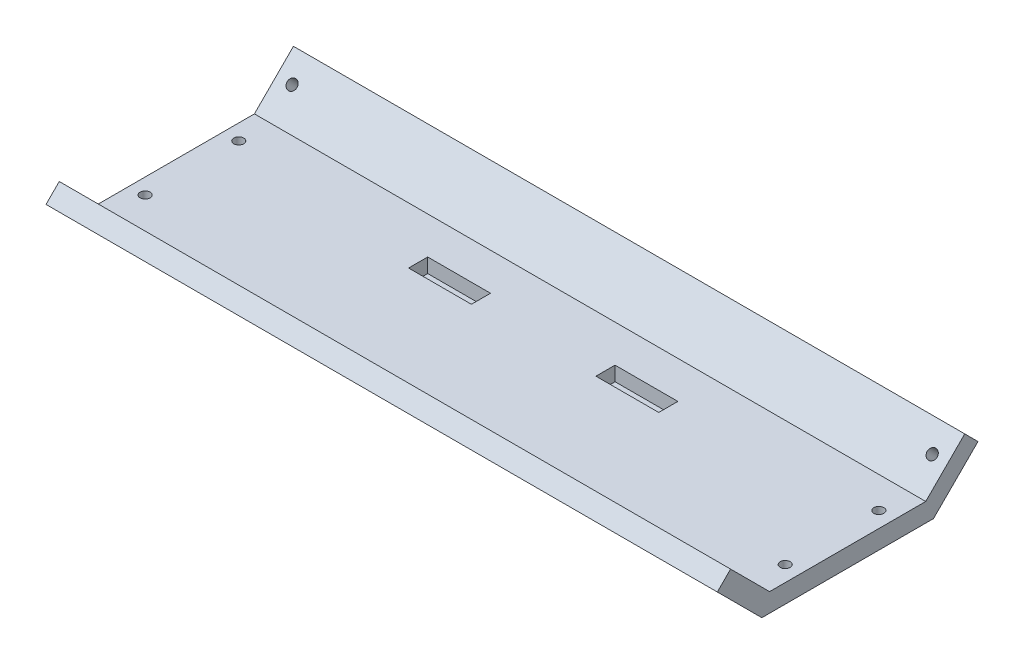
ISO-10303-21;
HEADER;
FILE_DESCRIPTION(('STEP AP214'),'2;1');
FILE_NAME('part.step','',(''),(''),'','','');
FILE_SCHEMA(('AUTOMOTIVE_DESIGN { 1 0 10303 214 1 1 1 1 }'));
ENDSEC;
DATA;
#1=APPLICATION_CONTEXT('core data for automotive mechanical design processes');
#2=APPLICATION_PROTOCOL_DEFINITION('international standard','automotive_design',2000,#1);
#3=PRODUCT_CONTEXT('',#1,'mechanical');
#4=PRODUCT('Part','Part','',(#3));
#5=PRODUCT_RELATED_PRODUCT_CATEGORY('part','',(#4));
#6=PRODUCT_DEFINITION_FORMATION('','',#4);
#7=PRODUCT_DEFINITION_CONTEXT('part definition',#1,'design');
#8=PRODUCT_DEFINITION('design','',#6,#7);
#9=PRODUCT_DEFINITION_SHAPE('','',#8);
#10=(LENGTH_UNIT() NAMED_UNIT(*) SI_UNIT(.MILLI.,.METRE.));
#11=(NAMED_UNIT(*) PLANE_ANGLE_UNIT() SI_UNIT($,.RADIAN.));
#12=(NAMED_UNIT(*) SI_UNIT($,.STERADIAN.) SOLID_ANGLE_UNIT());
#13=UNCERTAINTY_MEASURE_WITH_UNIT(LENGTH_MEASURE(1.E-05),#10,'distance_accuracy_value','');
#14=(GEOMETRIC_REPRESENTATION_CONTEXT(3) GLOBAL_UNCERTAINTY_ASSIGNED_CONTEXT((#13)) GLOBAL_UNIT_ASSIGNED_CONTEXT((#10,
#11,#12)) REPRESENTATION_CONTEXT('',''));
#15=CARTESIAN_POINT('',(0.,0.,0.));
#16=DIRECTION('',(0.,0.,1.));
#17=DIRECTION('',(1.,0.,0.));
#18=AXIS2_PLACEMENT_3D('',#15,#16,#17);
#19=CARTESIAN_POINT('',(-19.9375,-6.,-13.0625));
#20=DIRECTION('',(1.,0.,0.));
#21=DIRECTION('',(0.,0.,-1.));
#22=AXIS2_PLACEMENT_3D('',#19,#20,#21);
#23=PLANE('',#22);
#24=DIRECTION('',(0.,0.,1.));
#25=VECTOR('',#24,1.);
#26=CARTESIAN_POINT('',(-19.9375,-4.6,-13.0625));
#27=LINE('',#26,#25);
#28=CARTESIAN_POINT('',(-19.9375,-4.6,-13.0625));
#29=VERTEX_POINT('',#28);
#30=CARTESIAN_POINT('',(-19.9375,-4.6,-6.9375));
#31=VERTEX_POINT('',#30);
#32=EDGE_CURVE('E54',#29,#31,#27,.T.);
#33=ORIENTED_EDGE('',*,*,#32,.T.);
#34=DIRECTION('',(0.,1.,0.));
#35=VECTOR('',#34,1.);
#36=CARTESIAN_POINT('',(-19.9375,-6.,-6.9375));
#37=LINE('',#36,#35);
#38=CARTESIAN_POINT('',(-19.9375,0.,-6.9375));
#39=VERTEX_POINT('',#38);
#40=EDGE_CURVE('E184',#31,#39,#37,.T.);
#41=ORIENTED_EDGE('',*,*,#40,.T.);
#42=DIRECTION('',(0.,0.,-1.));
#43=VECTOR('',#42,1.);
#44=CARTESIAN_POINT('',(-19.9375,0.,-13.0625));
#45=LINE('',#44,#43);
#46=CARTESIAN_POINT('',(-19.9375,0.,-13.0625));
#47=VERTEX_POINT('',#46);
#48=EDGE_CURVE('E189',#39,#47,#45,.T.);
#49=ORIENTED_EDGE('',*,*,#48,.T.);
#50=DIRECTION('',(0.,1.,0.));
#51=VECTOR('',#50,1.);
#52=CARTESIAN_POINT('',(-19.9375,-6.,-13.0625));
#53=LINE('',#52,#51);
#54=EDGE_CURVE('E162',#29,#47,#53,.T.);
#55=ORIENTED_EDGE('',*,*,#54,.F.);
#56=EDGE_LOOP('',(#33,#41,#49,#55));
#57=FACE_BOUND('',#56,.T.);
#58=ADVANCED_FACE('F39',(#57),#23,.F.);
#59=CARTESIAN_POINT('',(-40.0625,-6.,-6.9375));
#60=DIRECTION('',(0.,0.,1.));
#61=DIRECTION('',(0.,-1.,0.));
#62=AXIS2_PLACEMENT_3D('',#59,#60,#61);
#63=PLANE('',#62);
#64=DIRECTION('',(-1.,0.,0.));
#65=VECTOR('',#64,1.);
#66=CARTESIAN_POINT('',(-19.9375,-4.6,-6.9375));
#67=LINE('',#66,#65);
#68=CARTESIAN_POINT('',(-40.0625,-4.6,-6.9375));
#69=VERTEX_POINT('',#68);
#70=EDGE_CURVE('E61',#31,#69,#67,.T.);
#71=ORIENTED_EDGE('',*,*,#70,.T.);
#72=DIRECTION('',(0.,1.,0.));
#73=VECTOR('',#72,1.);
#74=CARTESIAN_POINT('',(-40.0625,-6.,-6.9375));
#75=LINE('',#74,#73);
#76=CARTESIAN_POINT('',(-40.0625,0.,-6.9375));
#77=VERTEX_POINT('',#76);
#78=EDGE_CURVE('E163',#69,#77,#75,.T.);
#79=ORIENTED_EDGE('',*,*,#78,.T.);
#80=DIRECTION('',(1.,0.,0.));
#81=VECTOR('',#80,1.);
#82=CARTESIAN_POINT('',(-40.0625,0.,-6.9375));
#83=LINE('',#82,#81);
#84=EDGE_CURVE('E207',#77,#39,#83,.T.);
#85=ORIENTED_EDGE('',*,*,#84,.T.);
#86=ORIENTED_EDGE('',*,*,#40,.F.);
#87=EDGE_LOOP('',(#71,#79,#85,#86));
#88=FACE_BOUND('',#87,.T.);
#89=ADVANCED_FACE('F373',(#88),#63,.F.);
#90=CARTESIAN_POINT('',(-40.0625,-6.,-13.0625));
#91=DIRECTION('',(-1.,0.,0.));
#92=DIRECTION('',(0.,0.,1.));
#93=AXIS2_PLACEMENT_3D('',#90,#91,#92);
#94=PLANE('',#93);
#95=DIRECTION('',(0.,0.,-1.));
#96=VECTOR('',#95,1.);
#97=CARTESIAN_POINT('',(-40.0625,-4.6,-13.0625));
#98=LINE('',#97,#96);
#99=CARTESIAN_POINT('',(-40.0625,-4.6,-13.0625));
#100=VERTEX_POINT('',#99);
#101=EDGE_CURVE('E166',#69,#100,#98,.T.);
#102=ORIENTED_EDGE('',*,*,#101,.T.);
#103=DIRECTION('',(0.,1.,0.));
#104=VECTOR('',#103,1.);
#105=CARTESIAN_POINT('',(-40.0625,-6.,-13.0625));
#106=LINE('',#105,#104);
#107=CARTESIAN_POINT('',(-40.0625,0.,-13.0625));
#108=VERTEX_POINT('',#107);
#109=EDGE_CURVE('E152',#100,#108,#106,.T.);
#110=ORIENTED_EDGE('',*,*,#109,.T.);
#111=DIRECTION('',(0.,0.,1.));
#112=VECTOR('',#111,1.);
#113=CARTESIAN_POINT('',(-40.0625,0.,-13.0625));
#114=LINE('',#113,#112);
#115=EDGE_CURVE('E213',#108,#77,#114,.T.);
#116=ORIENTED_EDGE('',*,*,#115,.T.);
#117=ORIENTED_EDGE('',*,*,#78,.F.);
#118=EDGE_LOOP('',(#102,#110,#116,#117));
#119=FACE_BOUND('',#118,.T.);
#120=ADVANCED_FACE('F167',(#119),#94,.F.);
#121=CARTESIAN_POINT('',(-40.0625,-6.,-13.0625));
#122=DIRECTION('',(0.,0.,-1.));
#123=DIRECTION('',(-1.,0.,0.));
#124=AXIS2_PLACEMENT_3D('',#121,#122,#123);
#125=PLANE('',#124);
#126=DIRECTION('',(1.,0.,0.));
#127=VECTOR('',#126,1.);
#128=CARTESIAN_POINT('',(-19.9375,-4.6,-13.0625));
#129=LINE('',#128,#127);
#130=EDGE_CURVE('E156',#100,#29,#129,.T.);
#131=ORIENTED_EDGE('',*,*,#130,.T.);
#132=ORIENTED_EDGE('',*,*,#54,.T.);
#133=DIRECTION('',(-1.,0.,0.));
#134=VECTOR('',#133,1.);
#135=CARTESIAN_POINT('',(-40.0625,0.,-13.0625));
#136=LINE('',#135,#134);
#137=EDGE_CURVE('E158',#47,#108,#136,.T.);
#138=ORIENTED_EDGE('',*,*,#137,.T.);
#139=ORIENTED_EDGE('',*,*,#109,.F.);
#140=EDGE_LOOP('',(#131,#132,#138,#139));
#141=FACE_BOUND('',#140,.T.);
#142=ADVANCED_FACE('F154',(#141),#125,.F.);
#143=CARTESIAN_POINT('',(40.0625,-6.,-13.0625));
#144=DIRECTION('',(1.,0.,0.));
#145=DIRECTION('',(0.,0.,-1.));
#146=AXIS2_PLACEMENT_3D('',#143,#144,#145);
#147=PLANE('',#146);
#148=DIRECTION('',(0.,0.,1.));
#149=VECTOR('',#148,1.);
#150=CARTESIAN_POINT('',(40.0625,-4.6,-13.0625));
#151=LINE('',#150,#149);
#152=CARTESIAN_POINT('',(40.0625,-4.6,-13.0625));
#153=VERTEX_POINT('',#152);
#154=CARTESIAN_POINT('',(40.0625,-4.6,-6.9375));
#155=VERTEX_POINT('',#154);
#156=EDGE_CURVE('E175',#153,#155,#151,.T.);
#157=ORIENTED_EDGE('',*,*,#156,.T.);
#158=DIRECTION('',(0.,1.,0.));
#159=VECTOR('',#158,1.);
#160=CARTESIAN_POINT('',(40.0625,-6.,-6.9375));
#161=LINE('',#160,#159);
#162=CARTESIAN_POINT('',(40.0625,0.,-6.9375));
#163=VERTEX_POINT('',#162);
#164=EDGE_CURVE('E199',#155,#163,#161,.T.);
#165=ORIENTED_EDGE('',*,*,#164,.T.);
#166=DIRECTION('',(0.,0.,-1.));
#167=VECTOR('',#166,1.);
#168=CARTESIAN_POINT('',(40.0625,0.,-13.0625));
#169=LINE('',#168,#167);
#170=CARTESIAN_POINT('',(40.0625,0.,-13.0625));
#171=VERTEX_POINT('',#170);
#172=EDGE_CURVE('E185',#163,#171,#169,.T.);
#173=ORIENTED_EDGE('',*,*,#172,.T.);
#174=DIRECTION('',(0.,1.,0.));
#175=VECTOR('',#174,1.);
#176=CARTESIAN_POINT('',(40.0625,-6.,-13.0625));
#177=LINE('',#176,#175);
#178=EDGE_CURVE('E198',#153,#171,#177,.T.);
#179=ORIENTED_EDGE('',*,*,#178,.F.);
#180=EDGE_LOOP('',(#157,#165,#173,#179));
#181=FACE_BOUND('',#180,.T.);
#182=ADVANCED_FACE('F381',(#181),#147,.F.);
#183=CARTESIAN_POINT('',(19.9375,-6.,-6.9375));
#184=DIRECTION('',(0.,0.,1.));
#185=DIRECTION('',(0.,-1.,0.));
#186=AXIS2_PLACEMENT_3D('',#183,#184,#185);
#187=PLANE('',#186);
#188=DIRECTION('',(-1.,0.,0.));
#189=VECTOR('',#188,1.);
#190=CARTESIAN_POINT('',(40.0625,-4.6,-6.9375));
#191=LINE('',#190,#189);
#192=CARTESIAN_POINT('',(19.9375,-4.6,-6.9375));
#193=VERTEX_POINT('',#192);
#194=EDGE_CURVE('E177',#155,#193,#191,.T.);
#195=ORIENTED_EDGE('',*,*,#194,.T.);
#196=DIRECTION('',(0.,1.,0.));
#197=VECTOR('',#196,1.);
#198=CARTESIAN_POINT('',(19.9375,-6.,-6.9375));
#199=LINE('',#198,#197);
#200=CARTESIAN_POINT('',(19.9375,0.,-6.9375));
#201=VERTEX_POINT('',#200);
#202=EDGE_CURVE('E202',#193,#201,#199,.T.);
#203=ORIENTED_EDGE('',*,*,#202,.T.);
#204=DIRECTION('',(1.,0.,0.));
#205=VECTOR('',#204,1.);
#206=CARTESIAN_POINT('',(19.9375,0.,-6.9375));
#207=LINE('',#206,#205);
#208=EDGE_CURVE('E195',#201,#163,#207,.T.);
#209=ORIENTED_EDGE('',*,*,#208,.T.);
#210=ORIENTED_EDGE('',*,*,#164,.F.);
#211=EDGE_LOOP('',(#195,#203,#209,#210));
#212=FACE_BOUND('',#211,.T.);
#213=ADVANCED_FACE('F554',(#212),#187,.F.);
#214=CARTESIAN_POINT('',(19.9375,-6.,-13.0625));
#215=DIRECTION('',(-1.,0.,0.));
#216=DIRECTION('',(0.,0.,1.));
#217=AXIS2_PLACEMENT_3D('',#214,#215,#216);
#218=PLANE('',#217);
#219=DIRECTION('',(0.,0.,-1.));
#220=VECTOR('',#219,1.);
#221=CARTESIAN_POINT('',(19.9375,-4.6,-13.0625));
#222=LINE('',#221,#220);
#223=CARTESIAN_POINT('',(19.9375,-4.6,-13.0625));
#224=VERTEX_POINT('',#223);
#225=EDGE_CURVE('E179',#193,#224,#222,.T.);
#226=ORIENTED_EDGE('',*,*,#225,.T.);
#227=DIRECTION('',(0.,1.,0.));
#228=VECTOR('',#227,1.);
#229=CARTESIAN_POINT('',(19.9375,-6.,-13.0625));
#230=LINE('',#229,#228);
#231=CARTESIAN_POINT('',(19.9375,0.,-13.0625));
#232=VERTEX_POINT('',#231);
#233=EDGE_CURVE('E204',#224,#232,#230,.T.);
#234=ORIENTED_EDGE('',*,*,#233,.T.);
#235=DIRECTION('',(0.,0.,1.));
#236=VECTOR('',#235,1.);
#237=CARTESIAN_POINT('',(19.9375,0.,-13.0625));
#238=LINE('',#237,#236);
#239=EDGE_CURVE('E192',#232,#201,#238,.T.);
#240=ORIENTED_EDGE('',*,*,#239,.T.);
#241=ORIENTED_EDGE('',*,*,#202,.F.);
#242=EDGE_LOOP('',(#226,#234,#240,#241));
#243=FACE_BOUND('',#242,.T.);
#244=ADVANCED_FACE('F546',(#243),#218,.F.);
#245=CARTESIAN_POINT('',(19.9375,-6.,-13.0625));
#246=DIRECTION('',(0.,0.,-1.));
#247=DIRECTION('',(0.,1.,0.));
#248=AXIS2_PLACEMENT_3D('',#245,#246,#247);
#249=PLANE('',#248);
#250=DIRECTION('',(1.,0.,0.));
#251=VECTOR('',#250,1.);
#252=CARTESIAN_POINT('',(40.0625,-4.6,-13.0625));
#253=LINE('',#252,#251);
#254=EDGE_CURVE('E182',#224,#153,#253,.T.);
#255=ORIENTED_EDGE('',*,*,#254,.T.);
#256=ORIENTED_EDGE('',*,*,#178,.T.);
#257=DIRECTION('',(-1.,0.,0.));
#258=VECTOR('',#257,1.);
#259=CARTESIAN_POINT('',(19.9375,0.,-13.0625));
#260=LINE('',#259,#258);
#261=EDGE_CURVE('E188',#171,#232,#260,.T.);
#262=ORIENTED_EDGE('',*,*,#261,.T.);
#263=ORIENTED_EDGE('',*,*,#233,.F.);
#264=EDGE_LOOP('',(#255,#256,#262,#263));
#265=FACE_BOUND('',#264,.T.);
#266=ADVANCED_FACE('F441',(#265),#249,.F.);
#267=CARTESIAN_POINT('',(107.5,12.4999999999999,37.5000000000001));
#268=DIRECTION('',(0.,-0.707106781186547,-0.707106781186548));
#269=DIRECTION('',(0.,0.707106781186548,-0.707106781186547));
#270=AXIS2_PLACEMENT_3D('',#267,#268,#269);
#271=PLANE('',#270);
#272=DIRECTION('',(0.,-0.707106781186548,0.707106781186547));
#273=VECTOR('',#272,1.);
#274=CARTESIAN_POINT('',(-107.5,12.4999999999999,37.5000000000001));
#275=LINE('',#274,#273);
#276=CARTESIAN_POINT('',(-107.5,12.4999999999999,37.5000000000001));
#277=VERTEX_POINT('',#276);
#278=CARTESIAN_POINT('',(-107.5,8.25735931288065,41.7426406871193));
#279=VERTEX_POINT('',#278);
#280=EDGE_CURVE('E265',#277,#279,#275,.T.);
#281=ORIENTED_EDGE('',*,*,#280,.T.);
#282=DIRECTION('',(-1.,0.,0.));
#283=VECTOR('',#282,1.);
#284=CARTESIAN_POINT('',(107.5,8.25735931288065,41.7426406871193));
#285=LINE('',#284,#283);
#286=CARTESIAN_POINT('',(107.5,8.25735931288065,41.7426406871193));
#287=VERTEX_POINT('',#286);
#288=EDGE_CURVE('E11',#287,#279,#285,.T.);
#289=ORIENTED_EDGE('',*,*,#288,.F.);
#290=DIRECTION('',(0.,-0.707106781186548,0.707106781186547));
#291=VECTOR('',#290,1.);
#292=CARTESIAN_POINT('',(107.5,12.4999999999999,37.5000000000001));
#293=LINE('',#292,#291);
#294=CARTESIAN_POINT('',(107.5,12.4999999999999,37.5000000000001));
#295=VERTEX_POINT('',#294);
#296=EDGE_CURVE('E266',#295,#287,#293,.T.);
#297=ORIENTED_EDGE('',*,*,#296,.F.);
#298=DIRECTION('',(-1.,0.,0.));
#299=VECTOR('',#298,1.);
#300=CARTESIAN_POINT('',(107.5,12.4999999999999,37.5000000000001));
#301=LINE('',#300,#299);
#302=EDGE_CURVE('E284',#295,#277,#301,.T.);
#303=ORIENTED_EDGE('',*,*,#302,.T.);
#304=EDGE_LOOP('',(#281,#289,#297,#303));
#305=FACE_BOUND('',#304,.T.);
#306=ADVANCED_FACE('F41',(#305),#271,.F.);
#307=CARTESIAN_POINT('',(107.5,-6.,27.4852813742388));
#308=DIRECTION('',(0.,0.707106781186545,-0.707106781186551));
#309=DIRECTION('',(0.,0.707106781186551,0.707106781186545));
#310=AXIS2_PLACEMENT_3D('',#307,#308,#309);
#311=PLANE('',#310);
#312=CARTESIAN_POINT('',(-102.5,2.8284271247461,36.3137084989848));
#313=DIRECTION('',(0.,0.707106781186545,-0.707106781186551));
#314=DIRECTION('',(0.,0.707106781186551,0.707106781186545));
#315=AXIS2_PLACEMENT_3D('',#312,#313,#314);
#316=CIRCLE('',#315,1.6);
#317=CARTESIAN_POINT('',(-102.5,3.95979797464458,37.4450793488833));
#318=VERTEX_POINT('',#317);
#319=EDGE_CURVE('E238',#318,#318,#316,.T.);
#320=ORIENTED_EDGE('',*,*,#319,.T.);
#321=EDGE_LOOP('',(#320));
#322=FACE_BOUND('',#321,.T.);
#323=CARTESIAN_POINT('',(102.5,2.8284271247461,36.3137084989848));
#324=DIRECTION('',(0.,0.707106781186545,-0.707106781186551));
#325=DIRECTION('',(0.,0.707106781186551,0.707106781186545));
#326=AXIS2_PLACEMENT_3D('',#323,#324,#325);
#327=CIRCLE('',#326,1.6);
#328=CARTESIAN_POINT('',(102.5,3.95979797464458,37.4450793488833));
#329=VERTEX_POINT('',#328);
#330=EDGE_CURVE('E244',#329,#329,#327,.T.);
#331=ORIENTED_EDGE('',*,*,#330,.T.);
#332=EDGE_LOOP('',(#331));
#333=FACE_BOUND('',#332,.T.);
#334=DIRECTION('',(0.,-0.707106781186551,-0.707106781186544));
#335=VECTOR('',#334,1.);
#336=CARTESIAN_POINT('',(-107.5,-6.,27.4852813742388));
#337=LINE('',#336,#335);
#338=CARTESIAN_POINT('',(-107.5,-6.,27.4852813742388));
#339=VERTEX_POINT('',#338);
#340=EDGE_CURVE('E287',#279,#339,#337,.T.);
#341=ORIENTED_EDGE('',*,*,#340,.T.);
#342=DIRECTION('',(-1.,0.,0.));
#343=VECTOR('',#342,1.);
#344=CARTESIAN_POINT('',(107.5,-6.,27.4852813742388));
#345=LINE('',#344,#343);
#346=CARTESIAN_POINT('',(107.5,-6.,27.4852813742388));
#347=VERTEX_POINT('',#346);
#348=EDGE_CURVE('E47',#347,#339,#345,.T.);
#349=ORIENTED_EDGE('',*,*,#348,.F.);
#350=DIRECTION('',(0.,-0.707106781186551,-0.707106781186544));
#351=VECTOR('',#350,1.);
#352=CARTESIAN_POINT('',(107.5,-6.,27.4852813742388));
#353=LINE('',#352,#351);
#354=EDGE_CURVE('E269',#287,#347,#353,.T.);
#355=ORIENTED_EDGE('',*,*,#354,.F.);
#356=ORIENTED_EDGE('',*,*,#288,.T.);
#357=EDGE_LOOP('',(#341,#349,#355,#356));
#358=FACE_BOUND('',#357,.T.);
#359=ADVANCED_FACE('F344',(#322,#333,#358),#311,.F.);
#360=CARTESIAN_POINT('',(107.5,-6.,27.4852813742388));
#361=DIRECTION('',(0.,1.,0.));
#362=DIRECTION('',(0.,0.,1.));
#363=AXIS2_PLACEMENT_3D('',#360,#361,#362);
#364=PLANE('',#363);
#365=CARTESIAN_POINT('',(-102.5,-6.,-15.0000000000001));
#366=DIRECTION('',(0.,1.,0.));
#367=DIRECTION('',(0.,0.,1.));
#368=AXIS2_PLACEMENT_3D('',#365,#366,#367);
#369=CIRCLE('',#368,1.6);
#370=CARTESIAN_POINT('',(-102.5,-6.,-13.4000000000001));
#371=VERTEX_POINT('',#370);
#372=EDGE_CURVE('E226',#371,#371,#369,.T.);
#373=ORIENTED_EDGE('',*,*,#372,.T.);
#374=EDGE_LOOP('',(#373));
#375=FACE_BOUND('',#374,.T.);
#376=CARTESIAN_POINT('',(-102.5,-6.,15.0000000000001));
#377=DIRECTION('',(0.,1.,0.));
#378=DIRECTION('',(0.,0.,1.));
#379=AXIS2_PLACEMENT_3D('',#376,#377,#378);
#380=CIRCLE('',#379,1.6);
#381=CARTESIAN_POINT('',(-102.5,-6.,16.6000000000001));
#382=VERTEX_POINT('',#381);
#383=EDGE_CURVE('E232',#382,#382,#380,.T.);
#384=ORIENTED_EDGE('',*,*,#383,.T.);
#385=EDGE_LOOP('',(#384));
#386=FACE_BOUND('',#385,.T.);
#387=CARTESIAN_POINT('',(102.5,-6.,15.0000000000001));
#388=DIRECTION('',(0.,1.,0.));
#389=DIRECTION('',(0.,0.,1.));
#390=AXIS2_PLACEMENT_3D('',#387,#388,#389);
#391=CIRCLE('',#390,1.6);
#392=CARTESIAN_POINT('',(102.5,-6.,16.6000000000001));
#393=VERTEX_POINT('',#392);
#394=EDGE_CURVE('E250',#393,#393,#391,.T.);
#395=ORIENTED_EDGE('',*,*,#394,.T.);
#396=EDGE_LOOP('',(#395));
#397=FACE_BOUND('',#396,.T.);
#398=CARTESIAN_POINT('',(102.5,-6.,-15.0000000000001));
#399=DIRECTION('',(0.,1.,0.));
#400=DIRECTION('',(0.,0.,1.));
#401=AXIS2_PLACEMENT_3D('',#398,#399,#400);
#402=CIRCLE('',#401,1.6);
#403=CARTESIAN_POINT('',(102.5,-6.,-13.4000000000001));
#404=VERTEX_POINT('',#403);
#405=EDGE_CURVE('E256',#404,#404,#402,.T.);
#406=ORIENTED_EDGE('',*,*,#405,.T.);
#407=EDGE_LOOP('',(#406));
#408=FACE_BOUND('',#407,.T.);
#409=DIRECTION('',(0.,0.,-1.));
#410=VECTOR('',#409,1.);
#411=CARTESIAN_POINT('',(-107.5,-6.,27.4852813742388));
#412=LINE('',#411,#410);
#413=CARTESIAN_POINT('',(-107.5,-6.,-27.4852813742387));
#414=VERTEX_POINT('',#413);
#415=EDGE_CURVE('E289',#339,#414,#412,.T.);
#416=ORIENTED_EDGE('',*,*,#415,.T.);
#417=DIRECTION('',(-1.,0.,0.));
#418=VECTOR('',#417,1.);
#419=CARTESIAN_POINT('',(107.5,-6.,-27.4852813742387));
#420=LINE('',#419,#418);
#421=CARTESIAN_POINT('',(107.5,-6.,-27.4852813742387));
#422=VERTEX_POINT('',#421);
#423=EDGE_CURVE('E314',#422,#414,#420,.T.);
#424=ORIENTED_EDGE('',*,*,#423,.F.);
#425=DIRECTION('',(0.,0.,-1.));
#426=VECTOR('',#425,1.);
#427=CARTESIAN_POINT('',(107.5,-6.,27.4852813742388));
#428=LINE('',#427,#426);
#429=EDGE_CURVE('E272',#347,#422,#428,.T.);
#430=ORIENTED_EDGE('',*,*,#429,.F.);
#431=ORIENTED_EDGE('',*,*,#348,.T.);
#432=EDGE_LOOP('',(#416,#424,#430,#431));
#433=FACE_BOUND('',#432,.T.);
#434=ADVANCED_FACE('F321',(#375,#386,#397,#408,#433),#364,.F.);
#435=CARTESIAN_POINT('',(107.5,-6.,-27.4852813742387));
#436=DIRECTION('',(0.,0.707106781186547,0.707106781186548));
#437=DIRECTION('',(0.,-0.707106781186548,0.707106781186547));
#438=AXIS2_PLACEMENT_3D('',#435,#436,#437);
#439=PLANE('',#438);
#440=CARTESIAN_POINT('',(-102.5,2.82842712474617,-36.3137084989848));
#441=DIRECTION('',(0.,0.707106781186547,0.707106781186548));
#442=DIRECTION('',(0.,-0.707106781186548,0.707106781186547));
#443=AXIS2_PLACEMENT_3D('',#440,#441,#442);
#444=CIRCLE('',#443,1.6);
#445=CARTESIAN_POINT('',(-102.5,1.69705627484769,-35.1823376490863));
#446=VERTEX_POINT('',#445);
#447=EDGE_CURVE('E220',#446,#446,#444,.T.);
#448=ORIENTED_EDGE('',*,*,#447,.T.);
#449=EDGE_LOOP('',(#448));
#450=FACE_BOUND('',#449,.T.);
#451=CARTESIAN_POINT('',(102.5,2.82842712474615,-36.3137084989848));
#452=DIRECTION('',(0.,0.707106781186547,0.707106781186548));
#453=DIRECTION('',(0.,-0.707106781186548,0.707106781186547));
#454=AXIS2_PLACEMENT_3D('',#451,#452,#453);
#455=CIRCLE('',#454,1.6);
#456=CARTESIAN_POINT('',(102.5,1.69705627484767,-35.1823376490863));
#457=VERTEX_POINT('',#456);
#458=EDGE_CURVE('E262',#457,#457,#455,.T.);
#459=ORIENTED_EDGE('',*,*,#458,.T.);
#460=EDGE_LOOP('',(#459));
#461=FACE_BOUND('',#460,.T.);
#462=DIRECTION('',(0.,0.707106781186548,-0.707106781186547));
#463=VECTOR('',#462,1.);
#464=CARTESIAN_POINT('',(-107.5,-6.,-27.4852813742387));
#465=LINE('',#464,#463);
#466=CARTESIAN_POINT('',(-107.5,8.25735931288065,-41.7426406871193));
#467=VERTEX_POINT('',#466);
#468=EDGE_CURVE('E291',#414,#467,#465,.T.);
#469=ORIENTED_EDGE('',*,*,#468,.T.);
#470=DIRECTION('',(-1.,0.,0.));
#471=VECTOR('',#470,1.);
#472=CARTESIAN_POINT('',(107.5,8.25735931288065,-41.7426406871193));
#473=LINE('',#472,#471);
#474=CARTESIAN_POINT('',(107.5,8.25735931288065,-41.7426406871193));
#475=VERTEX_POINT('',#474);
#476=EDGE_CURVE('E311',#475,#467,#473,.T.);
#477=ORIENTED_EDGE('',*,*,#476,.F.);
#478=DIRECTION('',(0.,0.707106781186548,-0.707106781186547));
#479=VECTOR('',#478,1.);
#480=CARTESIAN_POINT('',(107.5,-6.,-27.4852813742387));
#481=LINE('',#480,#479);
#482=EDGE_CURVE('E274',#422,#475,#481,.T.);
#483=ORIENTED_EDGE('',*,*,#482,.F.);
#484=ORIENTED_EDGE('',*,*,#423,.T.);
#485=EDGE_LOOP('',(#469,#477,#483,#484));
#486=FACE_BOUND('',#485,.T.);
#487=ADVANCED_FACE('F332',(#450,#461,#486),#439,.F.);
#488=CARTESIAN_POINT('',(107.5,12.5,-37.5));
#489=DIRECTION('',(0.,-0.707106781186547,0.707106781186548));
#490=DIRECTION('',(0.,-0.707106781186548,-0.707106781186547));
#491=AXIS2_PLACEMENT_3D('',#488,#489,#490);
#492=PLANE('',#491);
#493=DIRECTION('',(0.,0.707106781186548,0.707106781186547));
#494=VECTOR('',#493,1.);
#495=CARTESIAN_POINT('',(-107.5,12.5,-37.5));
#496=LINE('',#495,#494);
#497=CARTESIAN_POINT('',(-107.5,12.5,-37.5));
#498=VERTEX_POINT('',#497);
#499=EDGE_CURVE('E293',#467,#498,#496,.T.);
#500=ORIENTED_EDGE('',*,*,#499,.T.);
#501=DIRECTION('',(-1.,0.,0.));
#502=VECTOR('',#501,1.);
#503=CARTESIAN_POINT('',(107.5,12.5,-37.5));
#504=LINE('',#503,#502);
#505=CARTESIAN_POINT('',(107.5,12.5,-37.5));
#506=VERTEX_POINT('',#505);
#507=EDGE_CURVE('E308',#506,#498,#504,.T.);
#508=ORIENTED_EDGE('',*,*,#507,.F.);
#509=DIRECTION('',(0.,0.707106781186548,0.707106781186547));
#510=VECTOR('',#509,1.);
#511=CARTESIAN_POINT('',(107.5,12.5,-37.5));
#512=LINE('',#511,#510);
#513=EDGE_CURVE('E276',#475,#506,#512,.T.);
#514=ORIENTED_EDGE('',*,*,#513,.F.);
#515=ORIENTED_EDGE('',*,*,#476,.T.);
#516=EDGE_LOOP('',(#500,#508,#514,#515));
#517=FACE_BOUND('',#516,.T.);
#518=ADVANCED_FACE('F336',(#517),#492,.F.);
#519=CARTESIAN_POINT('',(107.5,0.,-25.0000000000001));
#520=DIRECTION('',(0.,-0.707106781186546,-0.707106781186549));
#521=DIRECTION('',(0.,0.707106781186549,-0.707106781186546));
#522=AXIS2_PLACEMENT_3D('',#519,#520,#521);
#523=PLANE('',#522);
#524=CARTESIAN_POINT('',(-102.5,7.07106781186545,-32.0710678118655));
#525=DIRECTION('',(0.,0.707106781186546,0.707106781186549));
#526=DIRECTION('',(0.,-0.707106781186549,0.707106781186546));
#527=AXIS2_PLACEMENT_3D('',#524,#525,#526);
#528=CIRCLE('',#527,1.6);
#529=CARTESIAN_POINT('',(-102.5,5.93969696196697,-30.9396969619671));
#530=VERTEX_POINT('',#529);
#531=EDGE_CURVE('E201',#530,#530,#528,.T.);
#532=ORIENTED_EDGE('',*,*,#531,.F.);
#533=EDGE_LOOP('',(#532));
#534=FACE_BOUND('',#533,.T.);
#535=CARTESIAN_POINT('',(102.5,7.07106781186544,-32.0710678118655));
#536=DIRECTION('',(0.,0.707106781186546,0.707106781186549));
#537=DIRECTION('',(0.,-0.707106781186549,0.707106781186546));
#538=AXIS2_PLACEMENT_3D('',#535,#536,#537);
#539=CIRCLE('',#538,1.6);
#540=CARTESIAN_POINT('',(102.5,5.93969696196696,-30.939696961967));
#541=VERTEX_POINT('',#540);
#542=EDGE_CURVE('E259',#541,#541,#539,.T.);
#543=ORIENTED_EDGE('',*,*,#542,.F.);
#544=EDGE_LOOP('',(#543));
#545=FACE_BOUND('',#544,.T.);
#546=DIRECTION('',(0.,-0.707106781186549,0.707106781186546));
#547=VECTOR('',#546,1.);
#548=CARTESIAN_POINT('',(-107.5,0.,-25.0000000000001));
#549=LINE('',#548,#547);
#550=CARTESIAN_POINT('',(-107.5,0.,-25.0000000000001));
#551=VERTEX_POINT('',#550);
#552=EDGE_CURVE('E295',#498,#551,#549,.T.);
#553=ORIENTED_EDGE('',*,*,#552,.T.);
#554=DIRECTION('',(-1.,0.,0.));
#555=VECTOR('',#554,1.);
#556=CARTESIAN_POINT('',(107.5,0.,-25.0000000000001));
#557=LINE('',#556,#555);
#558=CARTESIAN_POINT('',(107.5,0.,-25.0000000000001));
#559=VERTEX_POINT('',#558);
#560=EDGE_CURVE('E305',#559,#551,#557,.T.);
#561=ORIENTED_EDGE('',*,*,#560,.F.);
#562=DIRECTION('',(0.,-0.707106781186549,0.707106781186546));
#563=VECTOR('',#562,1.);
#564=CARTESIAN_POINT('',(107.5,0.,-25.0000000000001));
#565=LINE('',#564,#563);
#566=EDGE_CURVE('E278',#506,#559,#565,.T.);
#567=ORIENTED_EDGE('',*,*,#566,.F.);
#568=ORIENTED_EDGE('',*,*,#507,.T.);
#569=EDGE_LOOP('',(#553,#561,#567,#568));
#570=FACE_BOUND('',#569,.T.);
#571=ADVANCED_FACE('F357',(#534,#545,#570),#523,.F.);
#572=CARTESIAN_POINT('',(107.5,0.,25.0000000000001));
#573=DIRECTION('',(0.,-1.,0.));
#574=DIRECTION('',(0.,0.,-1.));
#575=AXIS2_PLACEMENT_3D('',#572,#573,#574);
#576=PLANE('',#575);
#577=ORIENTED_EDGE('',*,*,#261,.F.);
#578=ORIENTED_EDGE('',*,*,#172,.F.);
#579=ORIENTED_EDGE('',*,*,#208,.F.);
#580=ORIENTED_EDGE('',*,*,#239,.F.);
#581=EDGE_LOOP('',(#577,#578,#579,#580));
#582=FACE_BOUND('',#581,.T.);
#583=ORIENTED_EDGE('',*,*,#137,.F.);
#584=ORIENTED_EDGE('',*,*,#48,.F.);
#585=ORIENTED_EDGE('',*,*,#84,.F.);
#586=ORIENTED_EDGE('',*,*,#115,.F.);
#587=EDGE_LOOP('',(#583,#584,#585,#586));
#588=FACE_BOUND('',#587,.T.);
#589=CARTESIAN_POINT('',(-102.5,0.,-15.0000000000001));
#590=DIRECTION('',(0.,1.,0.));
#591=DIRECTION('',(0.,0.,1.));
#592=AXIS2_PLACEMENT_3D('',#589,#590,#591);
#593=CIRCLE('',#592,1.6);
#594=CARTESIAN_POINT('',(-102.5,0.,-13.4000000000001));
#595=VERTEX_POINT('',#594);
#596=EDGE_CURVE('E223',#595,#595,#593,.T.);
#597=ORIENTED_EDGE('',*,*,#596,.F.);
#598=EDGE_LOOP('',(#597));
#599=FACE_BOUND('',#598,.T.);
#600=CARTESIAN_POINT('',(-102.5,0.,15.0000000000001));
#601=DIRECTION('',(0.,1.,0.));
#602=DIRECTION('',(0.,0.,1.));
#603=AXIS2_PLACEMENT_3D('',#600,#601,#602);
#604=CIRCLE('',#603,1.6);
#605=CARTESIAN_POINT('',(-102.5,0.,16.6000000000001));
#606=VERTEX_POINT('',#605);
#607=EDGE_CURVE('E229',#606,#606,#604,.T.);
#608=ORIENTED_EDGE('',*,*,#607,.F.);
#609=EDGE_LOOP('',(#608));
#610=FACE_BOUND('',#609,.T.);
#611=CARTESIAN_POINT('',(102.5,0.,15.0000000000001));
#612=DIRECTION('',(0.,1.,0.));
#613=DIRECTION('',(0.,0.,1.));
#614=AXIS2_PLACEMENT_3D('',#611,#612,#613);
#615=CIRCLE('',#614,1.6);
#616=CARTESIAN_POINT('',(102.5,0.,16.6000000000001));
#617=VERTEX_POINT('',#616);
#618=EDGE_CURVE('E247',#617,#617,#615,.T.);
#619=ORIENTED_EDGE('',*,*,#618,.F.);
#620=EDGE_LOOP('',(#619));
#621=FACE_BOUND('',#620,.T.);
#622=CARTESIAN_POINT('',(102.5,0.,-15.0000000000001));
#623=DIRECTION('',(0.,1.,0.));
#624=DIRECTION('',(0.,0.,1.));
#625=AXIS2_PLACEMENT_3D('',#622,#623,#624);
#626=CIRCLE('',#625,1.6);
#627=CARTESIAN_POINT('',(102.5,0.,-13.4000000000001));
#628=VERTEX_POINT('',#627);
#629=EDGE_CURVE('E253',#628,#628,#626,.T.);
#630=ORIENTED_EDGE('',*,*,#629,.F.);
#631=EDGE_LOOP('',(#630));
#632=FACE_BOUND('',#631,.T.);
#633=DIRECTION('',(0.,0.,1.));
#634=VECTOR('',#633,1.);
#635=CARTESIAN_POINT('',(-107.5,0.,25.0000000000001));
#636=LINE('',#635,#634);
#637=CARTESIAN_POINT('',(-107.5,0.,25.0000000000001));
#638=VERTEX_POINT('',#637);
#639=EDGE_CURVE('E297',#551,#638,#636,.T.);
#640=ORIENTED_EDGE('',*,*,#639,.T.);
#641=DIRECTION('',(-1.,0.,0.));
#642=VECTOR('',#641,1.);
#643=CARTESIAN_POINT('',(107.5,0.,25.0000000000001));
#644=LINE('',#643,#642);
#645=CARTESIAN_POINT('',(107.5,0.,25.0000000000001));
#646=VERTEX_POINT('',#645);
#647=EDGE_CURVE('E302',#646,#638,#644,.T.);
#648=ORIENTED_EDGE('',*,*,#647,.F.);
#649=DIRECTION('',(0.,0.,1.));
#650=VECTOR('',#649,1.);
#651=CARTESIAN_POINT('',(107.5,0.,25.0000000000001));
#652=LINE('',#651,#650);
#653=EDGE_CURVE('E280',#559,#646,#652,.T.);
#654=ORIENTED_EDGE('',*,*,#653,.F.);
#655=ORIENTED_EDGE('',*,*,#560,.T.);
#656=EDGE_LOOP('',(#640,#648,#654,#655));
#657=FACE_BOUND('',#656,.T.);
#658=ADVANCED_FACE('F355',(#582,#588,#599,#610,#621,#632,#657),#576,.F.);
#659=CARTESIAN_POINT('',(107.5,0.,25.0000000000001));
#660=DIRECTION('',(0.,-0.707106781186551,0.707106781186544));
#661=DIRECTION('',(0.,-0.707106781186544,-0.707106781186551));
#662=AXIS2_PLACEMENT_3D('',#659,#660,#661);
#663=PLANE('',#662);
#664=CARTESIAN_POINT('',(-102.5,7.0710678118654,32.0710678118655));
#665=DIRECTION('',(0.,0.707106781186551,-0.707106781186544));
#666=DIRECTION('',(0.,0.707106781186544,0.707106781186551));
#667=AXIS2_PLACEMENT_3D('',#664,#665,#666);
#668=CIRCLE('',#667,1.6);
#669=CARTESIAN_POINT('',(-102.5,8.20243866176388,33.202438661764));
#670=VERTEX_POINT('',#669);
#671=EDGE_CURVE('E235',#670,#670,#668,.T.);
#672=ORIENTED_EDGE('',*,*,#671,.F.);
#673=EDGE_LOOP('',(#672));
#674=FACE_BOUND('',#673,.T.);
#675=CARTESIAN_POINT('',(102.5,7.0710678118654,32.0710678118655));
#676=DIRECTION('',(0.,0.707106781186551,-0.707106781186544));
#677=DIRECTION('',(0.,0.707106781186544,0.707106781186551));
#678=AXIS2_PLACEMENT_3D('',#675,#676,#677);
#679=CIRCLE('',#678,1.6);
#680=CARTESIAN_POINT('',(102.5,8.20243866176388,33.202438661764));
#681=VERTEX_POINT('',#680);
#682=EDGE_CURVE('E241',#681,#681,#679,.T.);
#683=ORIENTED_EDGE('',*,*,#682,.F.);
#684=EDGE_LOOP('',(#683));
#685=FACE_BOUND('',#684,.T.);
#686=DIRECTION('',(0.,0.707106781186544,0.707106781186551));
#687=VECTOR('',#686,1.);
#688=CARTESIAN_POINT('',(-107.5,0.,25.0000000000001));
#689=LINE('',#688,#687);
#690=EDGE_CURVE('E270',#638,#277,#689,.T.);
#691=ORIENTED_EDGE('',*,*,#690,.T.);
#692=ORIENTED_EDGE('',*,*,#302,.F.);
#693=DIRECTION('',(0.,0.707106781186544,0.707106781186551));
#694=VECTOR('',#693,1.);
#695=CARTESIAN_POINT('',(107.5,0.,25.0000000000001));
#696=LINE('',#695,#694);
#697=EDGE_CURVE('E282',#646,#295,#696,.T.);
#698=ORIENTED_EDGE('',*,*,#697,.F.);
#699=ORIENTED_EDGE('',*,*,#647,.T.);
#700=EDGE_LOOP('',(#691,#692,#698,#699));
#701=FACE_BOUND('',#700,.T.);
#702=ADVANCED_FACE('F350',(#674,#685,#701),#663,.F.);
#703=CARTESIAN_POINT('',(107.5,0.,0.));
#704=DIRECTION('',(-1.,0.,0.));
#705=DIRECTION('',(0.,0.,1.));
#706=AXIS2_PLACEMENT_3D('',#703,#704,#705);
#707=PLANE('',#706);
#708=ORIENTED_EDGE('',*,*,#296,.T.);
#709=ORIENTED_EDGE('',*,*,#354,.T.);
#710=ORIENTED_EDGE('',*,*,#429,.T.);
#711=ORIENTED_EDGE('',*,*,#482,.T.);
#712=ORIENTED_EDGE('',*,*,#513,.T.);
#713=ORIENTED_EDGE('',*,*,#566,.T.);
#714=ORIENTED_EDGE('',*,*,#653,.T.);
#715=ORIENTED_EDGE('',*,*,#697,.T.);
#716=EDGE_LOOP('',(#708,#709,#710,#711,#712,#713,#714,#715));
#717=FACE_BOUND('',#716,.T.);
#718=ADVANCED_FACE('F340',(#717),#707,.F.);
#719=CARTESIAN_POINT('',(-107.5,0.,0.));
#720=DIRECTION('',(-1.,0.,0.));
#721=DIRECTION('',(0.,0.,1.));
#722=AXIS2_PLACEMENT_3D('',#719,#720,#721);
#723=PLANE('',#722);
#724=ORIENTED_EDGE('',*,*,#280,.F.);
#725=ORIENTED_EDGE('',*,*,#690,.F.);
#726=ORIENTED_EDGE('',*,*,#639,.F.);
#727=ORIENTED_EDGE('',*,*,#552,.F.);
#728=ORIENTED_EDGE('',*,*,#499,.F.);
#729=ORIENTED_EDGE('',*,*,#468,.F.);
#730=ORIENTED_EDGE('',*,*,#415,.F.);
#731=ORIENTED_EDGE('',*,*,#340,.F.);
#732=EDGE_LOOP('',(#724,#725,#726,#727,#728,#729,#730,#731));
#733=FACE_BOUND('',#732,.T.);
#734=ADVANCED_FACE('F327',(#733),#723,.T.);
#735=CARTESIAN_POINT('',(102.5,7.07106781186544,-32.0710678118655));
#736=DIRECTION('',(0.,0.707106781186546,0.707106781186549));
#737=DIRECTION('',(0.,-0.707106781186549,0.707106781186546));
#738=AXIS2_PLACEMENT_3D('',#735,#736,#737);
#739=CYLINDRICAL_SURFACE('',#738,1.6);
#740=ORIENTED_EDGE('',*,*,#542,.T.);
#741=EDGE_LOOP('',(#740));
#742=FACE_BOUND('',#741,.T.);
#743=ORIENTED_EDGE('',*,*,#458,.F.);
#744=EDGE_LOOP('',(#743));
#745=FACE_BOUND('',#744,.T.);
#746=ADVANCED_FACE('F415',(#742,#745),#739,.F.);
#747=CARTESIAN_POINT('',(102.5,0.,-15.0000000000001));
#748=DIRECTION('',(0.,1.,0.));
#749=DIRECTION('',(0.,0.,1.));
#750=AXIS2_PLACEMENT_3D('',#747,#748,#749);
#751=CYLINDRICAL_SURFACE('',#750,1.6);
#752=ORIENTED_EDGE('',*,*,#405,.F.);
#753=EDGE_LOOP('',(#752));
#754=FACE_BOUND('',#753,.T.);
#755=ORIENTED_EDGE('',*,*,#629,.T.);
#756=EDGE_LOOP('',(#755));
#757=FACE_BOUND('',#756,.T.);
#758=ADVANCED_FACE('F411',(#754,#757),#751,.F.);
#759=CARTESIAN_POINT('',(102.5,0.,15.0000000000001));
#760=DIRECTION('',(0.,1.,0.));
#761=DIRECTION('',(0.,0.,1.));
#762=AXIS2_PLACEMENT_3D('',#759,#760,#761);
#763=CYLINDRICAL_SURFACE('',#762,1.6);
#764=ORIENTED_EDGE('',*,*,#394,.F.);
#765=EDGE_LOOP('',(#764));
#766=FACE_BOUND('',#765,.T.);
#767=ORIENTED_EDGE('',*,*,#618,.T.);
#768=EDGE_LOOP('',(#767));
#769=FACE_BOUND('',#768,.T.);
#770=ADVANCED_FACE('F407',(#766,#769),#763,.F.);
#771=CARTESIAN_POINT('',(102.5,7.0710678118654,32.0710678118655));
#772=DIRECTION('',(0.,0.707106781186551,-0.707106781186544));
#773=DIRECTION('',(0.,0.707106781186544,0.707106781186551));
#774=AXIS2_PLACEMENT_3D('',#771,#772,#773);
#775=CYLINDRICAL_SURFACE('',#774,1.6);
#776=ORIENTED_EDGE('',*,*,#682,.T.);
#777=EDGE_LOOP('',(#776));
#778=FACE_BOUND('',#777,.T.);
#779=ORIENTED_EDGE('',*,*,#330,.F.);
#780=EDGE_LOOP('',(#779));
#781=FACE_BOUND('',#780,.T.);
#782=ADVANCED_FACE('F403',(#778,#781),#775,.F.);
#783=CARTESIAN_POINT('',(-102.5,7.0710678118654,32.0710678118655));
#784=DIRECTION('',(0.,0.707106781186551,-0.707106781186544));
#785=DIRECTION('',(0.,0.707106781186544,0.707106781186551));
#786=AXIS2_PLACEMENT_3D('',#783,#784,#785);
#787=CYLINDRICAL_SURFACE('',#786,1.6);
#788=ORIENTED_EDGE('',*,*,#671,.T.);
#789=EDGE_LOOP('',(#788));
#790=FACE_BOUND('',#789,.T.);
#791=ORIENTED_EDGE('',*,*,#319,.F.);
#792=EDGE_LOOP('',(#791));
#793=FACE_BOUND('',#792,.T.);
#794=ADVANCED_FACE('F399',(#790,#793),#787,.F.);
#795=CARTESIAN_POINT('',(-102.5,0.,15.0000000000001));
#796=DIRECTION('',(0.,1.,0.));
#797=DIRECTION('',(0.,0.,1.));
#798=AXIS2_PLACEMENT_3D('',#795,#796,#797);
#799=CYLINDRICAL_SURFACE('',#798,1.6);
#800=ORIENTED_EDGE('',*,*,#383,.F.);
#801=EDGE_LOOP('',(#800));
#802=FACE_BOUND('',#801,.T.);
#803=ORIENTED_EDGE('',*,*,#607,.T.);
#804=EDGE_LOOP('',(#803));
#805=FACE_BOUND('',#804,.T.);
#806=ADVANCED_FACE('F395',(#802,#805),#799,.F.);
#807=CARTESIAN_POINT('',(-102.5,0.,-15.0000000000001));
#808=DIRECTION('',(0.,1.,0.));
#809=DIRECTION('',(0.,0.,1.));
#810=AXIS2_PLACEMENT_3D('',#807,#808,#809);
#811=CYLINDRICAL_SURFACE('',#810,1.6);
#812=ORIENTED_EDGE('',*,*,#372,.F.);
#813=EDGE_LOOP('',(#812));
#814=FACE_BOUND('',#813,.T.);
#815=ORIENTED_EDGE('',*,*,#596,.T.);
#816=EDGE_LOOP('',(#815));
#817=FACE_BOUND('',#816,.T.);
#818=ADVANCED_FACE('F391',(#814,#817),#811,.F.);
#819=CARTESIAN_POINT('',(-102.5,7.07106781186545,-32.0710678118655));
#820=DIRECTION('',(0.,0.707106781186546,0.707106781186549));
#821=DIRECTION('',(0.,-0.707106781186549,0.707106781186546));
#822=AXIS2_PLACEMENT_3D('',#819,#820,#821);
#823=CYLINDRICAL_SURFACE('',#822,1.6);
#824=ORIENTED_EDGE('',*,*,#531,.T.);
#825=EDGE_LOOP('',(#824));
#826=FACE_BOUND('',#825,.T.);
#827=ORIENTED_EDGE('',*,*,#447,.F.);
#828=EDGE_LOOP('',(#827));
#829=FACE_BOUND('',#828,.T.);
#830=ADVANCED_FACE('F387',(#826,#829),#823,.F.);
#831=CARTESIAN_POINT('',(0.,-4.6,0.));
#832=DIRECTION('',(0.,-1.,0.));
#833=DIRECTION('',(0.,0.,-1.));
#834=AXIS2_PLACEMENT_3D('',#831,#832,#833);
#835=PLANE('',#834);
#836=ORIENTED_EDGE('',*,*,#156,.F.);
#837=ORIENTED_EDGE('',*,*,#254,.F.);
#838=ORIENTED_EDGE('',*,*,#225,.F.);
#839=ORIENTED_EDGE('',*,*,#194,.F.);
#840=EDGE_LOOP('',(#836,#837,#838,#839));
#841=FACE_BOUND('',#840,.T.);
#842=ADVANCED_FACE('F390',(#841),#835,.F.);
#843=CARTESIAN_POINT('',(0.,-4.6,0.));
#844=DIRECTION('',(0.,-1.,0.));
#845=DIRECTION('',(0.,0.,-1.));
#846=AXIS2_PLACEMENT_3D('',#843,#844,#845);
#847=PLANE('',#846);
#848=ORIENTED_EDGE('',*,*,#32,.F.);
#849=ORIENTED_EDGE('',*,*,#130,.F.);
#850=ORIENTED_EDGE('',*,*,#101,.F.);
#851=ORIENTED_EDGE('',*,*,#70,.F.);
#852=EDGE_LOOP('',(#848,#849,#850,#851));
#853=FACE_BOUND('',#852,.T.);
#854=ADVANCED_FACE('F170',(#853),#847,.F.);
#855=CLOSED_SHELL('',(#58,#89,#120,#142,#182,#213,#244,#266,#306,#359,#434,#487,#518,#571,#658,
#702,#718,#734,#746,#758,#770,#782,#794,#806,#818,#830,#842,#854));
#856=MANIFOLD_SOLID_BREP('B2',#855);
#857=ADVANCED_BREP_SHAPE_REPRESENTATION('',(#18,#856),#14);
#858=SHAPE_DEFINITION_REPRESENTATION(#9,#857);
ENDSEC;
END-ISO-10303-21;
